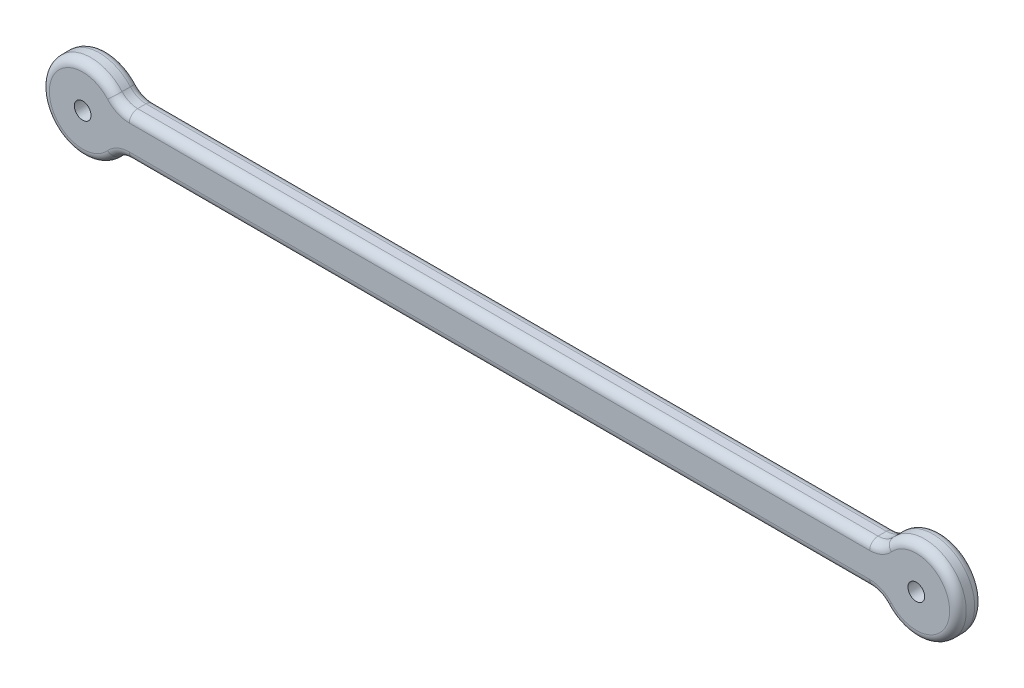
ISO-10303-21;
HEADER;
FILE_DESCRIPTION(('STEP AP214'),'2;1');
FILE_NAME('part.step','',(''),(''),'','','');
FILE_SCHEMA(('AUTOMOTIVE_DESIGN { 1 0 10303 214 1 1 1 1 }'));
ENDSEC;
DATA;
#1=APPLICATION_CONTEXT('core data for automotive mechanical design processes');
#2=APPLICATION_PROTOCOL_DEFINITION('international standard','automotive_design',2000,#1);
#3=PRODUCT_CONTEXT('',#1,'mechanical');
#4=PRODUCT('Part','Part','',(#3));
#5=PRODUCT_RELATED_PRODUCT_CATEGORY('part','',(#4));
#6=PRODUCT_DEFINITION_FORMATION('','',#4);
#7=PRODUCT_DEFINITION_CONTEXT('part definition',#1,'design');
#8=PRODUCT_DEFINITION('design','',#6,#7);
#9=PRODUCT_DEFINITION_SHAPE('','',#8);
#10=(LENGTH_UNIT() NAMED_UNIT(*) SI_UNIT(.MILLI.,.METRE.));
#11=(NAMED_UNIT(*) PLANE_ANGLE_UNIT() SI_UNIT($,.RADIAN.));
#12=(NAMED_UNIT(*) SI_UNIT($,.STERADIAN.) SOLID_ANGLE_UNIT());
#13=UNCERTAINTY_MEASURE_WITH_UNIT(LENGTH_MEASURE(1.E-05),#10,'distance_accuracy_value','');
#14=(GEOMETRIC_REPRESENTATION_CONTEXT(3) GLOBAL_UNCERTAINTY_ASSIGNED_CONTEXT((#13)) GLOBAL_UNIT_ASSIGNED_CONTEXT((#10,
#11,#12)) REPRESENTATION_CONTEXT('',''));
#15=CARTESIAN_POINT('',(0.,0.,0.));
#16=DIRECTION('',(0.,0.,1.));
#17=DIRECTION('',(1.,0.,0.));
#18=AXIS2_PLACEMENT_3D('',#15,#16,#17);
#19=CARTESIAN_POINT('',(88.8196601125,10.,-1.));
#20=DIRECTION('',(0.,0.,1.));
#21=DIRECTION('',(-0.0746580961721727,-0.997209190027823,0.));
#22=AXIS2_PLACEMENT_3D('',#19,#20,#21);
#23=TOROIDAL_SURFACE('',#22,7.,2.);
#24=CARTESIAN_POINT('',(94.0371520600001,5.33333333333287,-1.));
#25=DIRECTION('',(-0.666666666666609,-0.745355992499981,0.));
#26=DIRECTION('',(-0.745355992499982,0.666666666666608,0.));
#27=AXIS2_PLACEMENT_3D('',#24,#25,#26);
#28=CIRCLE('',#27,2.);
#29=CARTESIAN_POINT('',(94.0371520600001,5.3333333333331,-3.));
#30=VERTEX_POINT('',#29);
#31=CARTESIAN_POINT('',(92.5464400750002,6.66666666666667,-1.));
#32=VERTEX_POINT('',#31);
#33=EDGE_CURVE('E133',#30,#32,#28,.F.);
#34=ORIENTED_EDGE('',*,*,#33,.F.);
#35=CARTESIAN_POINT('',(88.8196601125,10.,-3.));
#36=DIRECTION('',(0.,0.,-1.));
#37=DIRECTION('',(0.745355992499995,-0.666666666666594,0.));
#38=AXIS2_PLACEMENT_3D('',#35,#36,#37);
#39=CIRCLE('',#38,7.00000000000029);
#40=CARTESIAN_POINT('',(88.8196601125,2.99999999999993,-3.));
#41=VERTEX_POINT('',#40);
#42=EDGE_CURVE('E127',#30,#41,#39,.T.);
#43=ORIENTED_EDGE('',*,*,#42,.T.);
#44=CARTESIAN_POINT('',(88.8196601125,3.,-1.));
#45=DIRECTION('',(1.,0.,0.));
#46=DIRECTION('',(0.,0.,-1.));
#47=AXIS2_PLACEMENT_3D('',#44,#45,#46);
#48=CIRCLE('',#47,2.);
#49=CARTESIAN_POINT('',(88.8196601125,5.,-1.));
#50=VERTEX_POINT('',#49);
#51=EDGE_CURVE('E131',#50,#41,#48,.F.);
#52=ORIENTED_EDGE('',*,*,#51,.F.);
#53=CARTESIAN_POINT('',(88.8196601125,10.,-1.));
#54=DIRECTION('',(0.,0.,1.));
#55=DIRECTION('',(1.,0.,0.));
#56=AXIS2_PLACEMENT_3D('',#53,#54,#55);
#57=CIRCLE('',#56,5.);
#58=EDGE_CURVE('E249',#50,#32,#57,.T.);
#59=ORIENTED_EDGE('',*,*,#58,.T.);
#60=EDGE_LOOP('',(#34,#43,#52,#59));
#61=FACE_BOUND('',#60,.T.);
#62=ADVANCED_FACE('F15',(#61),#23,.T.);
#63=CARTESIAN_POINT('',(-89.35043386611,3.,-1.));
#64=DIRECTION('',(1.,0.,0.));
#65=DIRECTION('',(0.,0.,-1.));
#66=AXIS2_PLACEMENT_3D('',#63,#64,#65);
#67=CYLINDRICAL_SURFACE('',#66,2.);
#68=ORIENTED_EDGE('',*,*,#51,.T.);
#69=DIRECTION('',(1.,0.,0.));
#70=VECTOR('',#69,1.);
#71=CARTESIAN_POINT('',(0.,3.,-3.));
#72=LINE('',#71,#70);
#73=CARTESIAN_POINT('',(-88.8196601125,3.,-3.));
#74=VERTEX_POINT('',#73);
#75=EDGE_CURVE('E139',#41,#74,#72,.F.);
#76=ORIENTED_EDGE('',*,*,#75,.T.);
#77=CARTESIAN_POINT('',(-88.8196601125,3.,-1.));
#78=DIRECTION('',(1.,0.,0.));
#79=DIRECTION('',(0.,-1.,0.));
#80=AXIS2_PLACEMENT_3D('',#77,#78,#79);
#81=CIRCLE('',#80,2.);
#82=CARTESIAN_POINT('',(-88.8196601125,5.,-1.));
#83=VERTEX_POINT('',#82);
#84=EDGE_CURVE('E149',#83,#74,#81,.F.);
#85=ORIENTED_EDGE('',*,*,#84,.F.);
#86=DIRECTION('',(1.,0.,0.));
#87=VECTOR('',#86,1.);
#88=CARTESIAN_POINT('',(91.33974596216,5.,-1.));
#89=LINE('',#88,#87);
#90=EDGE_CURVE('E147',#50,#83,#89,.F.);
#91=ORIENTED_EDGE('',*,*,#90,.F.);
#92=EDGE_LOOP('',(#68,#76,#85,#91));
#93=FACE_BOUND('',#92,.T.);
#94=ADVANCED_FACE('F144',(#93),#67,.T.);
#95=CARTESIAN_POINT('',(-88.8196601125,10.,-1.));
#96=DIRECTION('',(0.,0.,1.));
#97=DIRECTION('',(-0.793047909677989,-0.609159267314692,0.));
#98=AXIS2_PLACEMENT_3D('',#95,#96,#97);
#99=TOROIDAL_SURFACE('',#98,7.,2.);
#100=ORIENTED_EDGE('',*,*,#84,.T.);
#101=CARTESIAN_POINT('',(-88.8196601125,10.,-3.));
#102=DIRECTION('',(0.,0.,-1.));
#103=DIRECTION('',(0.,-1.,0.));
#104=AXIS2_PLACEMENT_3D('',#101,#102,#103);
#105=CIRCLE('',#104,7.);
#106=CARTESIAN_POINT('',(-94.0371520600001,5.33333333333319,-3.));
#107=VERTEX_POINT('',#106);
#108=EDGE_CURVE('E155',#74,#107,#105,.T.);
#109=ORIENTED_EDGE('',*,*,#108,.T.);
#110=CARTESIAN_POINT('',(-94.0371520600005,5.3333333333332,-1.));
#111=DIRECTION('',(-0.66666666666665,0.745355992499944,0.));
#112=DIRECTION('',(0.745355992499944,0.666666666666651,0.));
#113=AXIS2_PLACEMENT_3D('',#110,#111,#112);
#114=CIRCLE('',#113,2.);
#115=CARTESIAN_POINT('',(-92.5464400750004,6.66666666666664,-1.));
#116=VERTEX_POINT('',#115);
#117=EDGE_CURVE('E332',#116,#107,#114,.T.);
#118=ORIENTED_EDGE('',*,*,#117,.F.);
#119=CARTESIAN_POINT('',(-88.8196601125,10.,-1.));
#120=DIRECTION('',(0.,0.,1.));
#121=DIRECTION('',(1.,0.,0.));
#122=AXIS2_PLACEMENT_3D('',#119,#120,#121);
#123=CIRCLE('',#122,5.);
#124=EDGE_CURVE('E229',#116,#83,#123,.T.);
#125=ORIENTED_EDGE('',*,*,#124,.T.);
#126=EDGE_LOOP('',(#100,#109,#118,#125));
#127=FACE_BOUND('',#126,.T.);
#128=ADVANCED_FACE('F353',(#127),#99,.T.);
#129=CARTESIAN_POINT('',(-100.,0.,-1.));
#130=DIRECTION('',(0.,0.,1.));
#131=DIRECTION('',(0.779674632416826,-0.626184850955121,0.));
#132=AXIS2_PLACEMENT_3D('',#129,#130,#131);
#133=TOROIDAL_SURFACE('',#132,8.,2.);
#134=CARTESIAN_POINT('',(-94.03715206,-5.33333333333384,-1.));
#135=DIRECTION('',(-0.666666666666593,-0.745355992499996,0.));
#136=DIRECTION('',(-0.745355992499995,0.666666666666594,0.));
#137=AXIS2_PLACEMENT_3D('',#134,#135,#136);
#138=CIRCLE('',#137,2.);
#139=CARTESIAN_POINT('',(-92.5464400750001,-6.6666666666669,-1.));
#140=VERTEX_POINT('',#139);
#141=CARTESIAN_POINT('',(-94.0371520600001,-5.33333333333325,-3.));
#142=VERTEX_POINT('',#141);
#143=EDGE_CURVE('E305',#140,#142,#138,.F.);
#144=ORIENTED_EDGE('',*,*,#143,.F.);
#145=CARTESIAN_POINT('',(-100.,0.,-1.));
#146=DIRECTION('',(0.,0.,1.));
#147=DIRECTION('',(1.,0.,0.));
#148=AXIS2_PLACEMENT_3D('',#145,#146,#147);
#149=CIRCLE('',#148,10.);
#150=EDGE_CURVE('E218',#116,#140,#149,.T.);
#151=ORIENTED_EDGE('',*,*,#150,.F.);
#152=ORIENTED_EDGE('',*,*,#117,.T.);
#153=CARTESIAN_POINT('',(-100.,0.,-3.));
#154=DIRECTION('',(0.,0.,1.));
#155=DIRECTION('',(0.745355992499945,0.66666666666665,0.));
#156=AXIS2_PLACEMENT_3D('',#153,#154,#155);
#157=CIRCLE('',#156,8.00000000000009);
#158=EDGE_CURVE('E158',#107,#142,#157,.T.);
#159=ORIENTED_EDGE('',*,*,#158,.T.);
#160=EDGE_LOOP('',(#144,#151,#152,#159));
#161=FACE_BOUND('',#160,.T.);
#162=ADVANCED_FACE('F317',(#161),#133,.T.);
#163=CARTESIAN_POINT('',(-88.8196601125,-10.,-1.));
#164=DIRECTION('',(0.,0.,1.));
#165=DIRECTION('',(0.0746580961721727,0.997209190027823,0.));
#166=AXIS2_PLACEMENT_3D('',#163,#164,#165);
#167=TOROIDAL_SURFACE('',#166,7.,2.);
#168=ORIENTED_EDGE('',*,*,#143,.T.);
#169=CARTESIAN_POINT('',(-88.8196601125,-10.,-3.));
#170=DIRECTION('',(0.,0.,-1.));
#171=DIRECTION('',(-0.745355992499995,0.666666666666594,0.));
#172=AXIS2_PLACEMENT_3D('',#169,#170,#171);
#173=CIRCLE('',#172,7.00000000000029);
#174=CARTESIAN_POINT('',(-88.819660112195,-3.00000000010943,-3.));
#175=VERTEX_POINT('',#174);
#176=EDGE_CURVE('E497',#142,#175,#173,.T.);
#177=ORIENTED_EDGE('',*,*,#176,.T.);
#178=CARTESIAN_POINT('',(-88.81966011182,-3.,-1.));
#179=DIRECTION('',(-1.,0.,0.));
#180=DIRECTION('',(0.,0.,1.));
#181=AXIS2_PLACEMENT_3D('',#178,#179,#180);
#182=CIRCLE('',#181,2.);
#183=CARTESIAN_POINT('',(-88.81966011233,-5.,-1.));
#184=VERTEX_POINT('',#183);
#185=EDGE_CURVE('E300',#184,#175,#182,.F.);
#186=ORIENTED_EDGE('',*,*,#185,.F.);
#187=CARTESIAN_POINT('',(-88.8196601125,-10.,-1.));
#188=DIRECTION('',(0.,0.,1.));
#189=DIRECTION('',(1.,0.,0.));
#190=AXIS2_PLACEMENT_3D('',#187,#188,#189);
#191=CIRCLE('',#190,5.);
#192=EDGE_CURVE('E206',#184,#140,#191,.T.);
#193=ORIENTED_EDGE('',*,*,#192,.T.);
#194=EDGE_LOOP('',(#168,#177,#186,#193));
#195=FACE_BOUND('',#194,.T.);
#196=ADVANCED_FACE('F312',(#195),#167,.T.);
#197=CARTESIAN_POINT('',(89.35043386611,-3.,-1.));
#198=DIRECTION('',(-1.,0.,0.));
#199=DIRECTION('',(0.,0.,1.));
#200=AXIS2_PLACEMENT_3D('',#197,#198,#199);
#201=CYLINDRICAL_SURFACE('',#200,2.);
#202=ORIENTED_EDGE('',*,*,#185,.T.);
#203=DIRECTION('',(1.,0.,0.));
#204=VECTOR('',#203,1.);
#205=CARTESIAN_POINT('',(0.,-3.000000000146,-3.));
#206=LINE('',#205,#204);
#207=CARTESIAN_POINT('',(88.8196601125,-3.,-3.));
#208=VERTEX_POINT('',#207);
#209=EDGE_CURVE('E491',#175,#208,#206,.T.);
#210=ORIENTED_EDGE('',*,*,#209,.T.);
#211=CARTESIAN_POINT('',(88.8196601125,-3.,-1.));
#212=DIRECTION('',(-1.,0.,0.));
#213=DIRECTION('',(0.,1.,0.));
#214=AXIS2_PLACEMENT_3D('',#211,#212,#213);
#215=CIRCLE('',#214,2.);
#216=CARTESIAN_POINT('',(88.8196601125,-5.,-1.));
#217=VERTEX_POINT('',#216);
#218=EDGE_CURVE('E279',#217,#208,#215,.F.);
#219=ORIENTED_EDGE('',*,*,#218,.F.);
#220=DIRECTION('',(1.,0.,0.));
#221=VECTOR('',#220,1.);
#222=CARTESIAN_POINT('',(-91.33974596216,-5.,-1.));
#223=LINE('',#222,#221);
#224=EDGE_CURVE('E195',#184,#217,#223,.T.);
#225=ORIENTED_EDGE('',*,*,#224,.F.);
#226=EDGE_LOOP('',(#202,#210,#219,#225));
#227=FACE_BOUND('',#226,.T.);
#228=ADVANCED_FACE('F316',(#227),#201,.T.);
#229=CARTESIAN_POINT('',(88.8196601125,-10.,-1.));
#230=DIRECTION('',(0.,0.,1.));
#231=DIRECTION('',(0.793047909677989,0.609159267314692,0.));
#232=AXIS2_PLACEMENT_3D('',#229,#230,#231);
#233=TOROIDAL_SURFACE('',#232,7.,2.);
#234=ORIENTED_EDGE('',*,*,#218,.T.);
#235=CARTESIAN_POINT('',(88.8196601125,-10.,-3.));
#236=DIRECTION('',(0.,0.,-1.));
#237=DIRECTION('',(0.,1.,0.));
#238=AXIS2_PLACEMENT_3D('',#235,#236,#237);
#239=CIRCLE('',#238,7.);
#240=CARTESIAN_POINT('',(94.0371520600001,-5.33333333333319,-3.));
#241=VERTEX_POINT('',#240);
#242=EDGE_CURVE('E290',#208,#241,#239,.T.);
#243=ORIENTED_EDGE('',*,*,#242,.T.);
#244=CARTESIAN_POINT('',(94.0371520600005,-5.3333333333332,-1.));
#245=DIRECTION('',(0.66666666666665,-0.745355992499944,0.));
#246=DIRECTION('',(-0.745355992499944,-0.666666666666651,0.));
#247=AXIS2_PLACEMENT_3D('',#244,#245,#246);
#248=CIRCLE('',#247,2.);
#249=CARTESIAN_POINT('',(92.5464400750003,-6.66666666666677,-1.));
#250=VERTEX_POINT('',#249);
#251=EDGE_CURVE('E271',#250,#241,#248,.T.);
#252=ORIENTED_EDGE('',*,*,#251,.F.);
#253=CARTESIAN_POINT('',(88.8196601125,-10.,-1.));
#254=DIRECTION('',(0.,0.,1.));
#255=DIRECTION('',(1.,0.,0.));
#256=AXIS2_PLACEMENT_3D('',#253,#254,#255);
#257=CIRCLE('',#256,5.);
#258=EDGE_CURVE('E184',#250,#217,#257,.T.);
#259=ORIENTED_EDGE('',*,*,#258,.T.);
#260=EDGE_LOOP('',(#234,#243,#252,#259));
#261=FACE_BOUND('',#260,.T.);
#262=ADVANCED_FACE('F262',(#261),#233,.T.);
#263=CARTESIAN_POINT('',(100.,0.,-1.));
#264=DIRECTION('',(0.,0.,1.));
#265=DIRECTION('',(-0.779674632416826,0.626184850955121,0.));
#266=AXIS2_PLACEMENT_3D('',#263,#264,#265);
#267=TOROIDAL_SURFACE('',#266,8.,2.);
#268=ORIENTED_EDGE('',*,*,#33,.T.);
#269=CARTESIAN_POINT('',(100.,0.,-1.));
#270=DIRECTION('',(0.,0.,1.));
#271=DIRECTION('',(1.,0.,0.));
#272=AXIS2_PLACEMENT_3D('',#269,#270,#271);
#273=CIRCLE('',#272,10.);
#274=EDGE_CURVE('E283',#250,#32,#273,.T.);
#275=ORIENTED_EDGE('',*,*,#274,.F.);
#276=ORIENTED_EDGE('',*,*,#251,.T.);
#277=CARTESIAN_POINT('',(100.,0.,-3.));
#278=DIRECTION('',(0.,0.,1.));
#279=DIRECTION('',(-0.745355992499945,-0.66666666666665,0.));
#280=AXIS2_PLACEMENT_3D('',#277,#278,#279);
#281=CIRCLE('',#280,8.00000000000009);
#282=EDGE_CURVE('E169',#241,#30,#281,.T.);
#283=ORIENTED_EDGE('',*,*,#282,.T.);
#284=EDGE_LOOP('',(#268,#275,#276,#283));
#285=FACE_BOUND('',#284,.T.);
#286=ADVANCED_FACE('F256',(#285),#267,.T.);
#287=CARTESIAN_POINT('',(100.,0.,-3.));
#288=DIRECTION('',(0.,0.,1.));
#289=DIRECTION('',(1.,0.,0.));
#290=AXIS2_PLACEMENT_3D('',#287,#288,#289);
#291=CYLINDRICAL_SURFACE('',#290,10.);
#292=DIRECTION('',(0.,0.,1.));
#293=VECTOR('',#292,1.);
#294=CARTESIAN_POINT('',(92.546440075,-6.66666666666703,-10.8216));
#295=LINE('',#294,#293);
#296=CARTESIAN_POINT('',(92.5464400750001,-6.6666666666669,1.));
#297=VERTEX_POINT('',#296);
#298=EDGE_CURVE('E140',#297,#250,#295,.F.);
#299=ORIENTED_EDGE('',*,*,#298,.T.);
#300=ORIENTED_EDGE('',*,*,#274,.T.);
#301=DIRECTION('',(0.,0.,1.));
#302=VECTOR('',#301,1.);
#303=CARTESIAN_POINT('',(92.546440075,6.66666666666703,-10.8216));
#304=LINE('',#303,#302);
#305=CARTESIAN_POINT('',(92.546440075,6.66666666666674,1.));
#306=VERTEX_POINT('',#305);
#307=EDGE_CURVE('E240',#32,#306,#304,.T.);
#308=ORIENTED_EDGE('',*,*,#307,.T.);
#309=CARTESIAN_POINT('',(100.,0.,1.));
#310=DIRECTION('',(0.,0.,1.));
#311=DIRECTION('',(-0.769739187520105,-0.638358506793705,0.));
#312=AXIS2_PLACEMENT_3D('',#309,#310,#311);
#313=CIRCLE('',#312,10.);
#314=EDGE_CURVE('E165',#297,#306,#313,.T.);
#315=ORIENTED_EDGE('',*,*,#314,.F.);
#316=EDGE_LOOP('',(#299,#300,#308,#315));
#317=FACE_BOUND('',#316,.T.);
#318=ADVANCED_FACE('F261',(#317),#291,.T.);
#319=CARTESIAN_POINT('',(88.8196601125,10.,-10.8216));
#320=DIRECTION('',(0.,0.,1.));
#321=DIRECTION('',(1.,0.,0.));
#322=AXIS2_PLACEMENT_3D('',#319,#320,#321);
#323=CYLINDRICAL_SURFACE('',#322,5.);
#324=CARTESIAN_POINT('',(88.8196601125,10.,1.));
#325=DIRECTION('',(0.,0.,1.));
#326=DIRECTION('',(0.811797282516416,-0.583939356525112,0.));
#327=AXIS2_PLACEMENT_3D('',#324,#325,#326);
#328=CIRCLE('',#327,5.);
#329=CARTESIAN_POINT('',(88.8196601125,5.,1.));
#330=VERTEX_POINT('',#329);
#331=EDGE_CURVE('E243',#306,#330,#328,.F.);
#332=ORIENTED_EDGE('',*,*,#331,.F.);
#333=ORIENTED_EDGE('',*,*,#307,.F.);
#334=ORIENTED_EDGE('',*,*,#58,.F.);
#335=DIRECTION('',(0.,0.,1.));
#336=VECTOR('',#335,1.);
#337=CARTESIAN_POINT('',(88.8196601125,5.,-3.));
#338=LINE('',#337,#336);
#339=EDGE_CURVE('E238',#330,#50,#338,.F.);
#340=ORIENTED_EDGE('',*,*,#339,.F.);
#341=EDGE_LOOP('',(#332,#333,#334,#340));
#342=FACE_BOUND('',#341,.T.);
#343=ADVANCED_FACE('F792',(#342),#323,.F.);
#344=CARTESIAN_POINT('',(91.33974596216,5.,-3.));
#345=DIRECTION('',(0.,1.,0.));
#346=DIRECTION('',(0.,0.,1.));
#347=AXIS2_PLACEMENT_3D('',#344,#345,#346);
#348=PLANE('',#347);
#349=ORIENTED_EDGE('',*,*,#339,.T.);
#350=ORIENTED_EDGE('',*,*,#90,.T.);
#351=DIRECTION('',(0.,0.,1.));
#352=VECTOR('',#351,1.);
#353=CARTESIAN_POINT('',(-88.8196601125,5.,-10.8216));
#354=LINE('',#353,#352);
#355=CARTESIAN_POINT('',(-88.8196601126557,5.,1.));
#356=VERTEX_POINT('',#355);
#357=EDGE_CURVE('E219',#83,#356,#354,.T.);
#358=ORIENTED_EDGE('',*,*,#357,.T.);
#359=DIRECTION('',(-1.,0.,0.));
#360=VECTOR('',#359,1.);
#361=CARTESIAN_POINT('',(89.19329824241,5.,1.));
#362=LINE('',#361,#360);
#363=EDGE_CURVE('E232',#330,#356,#362,.T.);
#364=ORIENTED_EDGE('',*,*,#363,.F.);
#365=EDGE_LOOP('',(#349,#350,#358,#364));
#366=FACE_BOUND('',#365,.T.);
#367=ADVANCED_FACE('F377',(#366),#348,.T.);
#368=CARTESIAN_POINT('',(-88.8196601125,10.,-10.8216));
#369=DIRECTION('',(0.,0.,1.));
#370=DIRECTION('',(1.,0.,0.));
#371=AXIS2_PLACEMENT_3D('',#368,#369,#370);
#372=CYLINDRICAL_SURFACE('',#371,5.);
#373=CARTESIAN_POINT('',(-88.8196601125,10.,1.));
#374=DIRECTION('',(0.,0.,1.));
#375=DIRECTION('',(0.105955489701703,-0.994370873568847,0.));
#376=AXIS2_PLACEMENT_3D('',#373,#374,#375);
#377=CIRCLE('',#376,5.);
#378=CARTESIAN_POINT('',(-92.5464400750002,6.66666666666643,1.));
#379=VERTEX_POINT('',#378);
#380=EDGE_CURVE('E222',#356,#379,#377,.F.);
#381=ORIENTED_EDGE('',*,*,#380,.F.);
#382=ORIENTED_EDGE('',*,*,#357,.F.);
#383=ORIENTED_EDGE('',*,*,#124,.F.);
#384=DIRECTION('',(0.,0.,1.));
#385=VECTOR('',#384,1.);
#386=CARTESIAN_POINT('',(-92.5464400750006,6.66666666666651,-3.));
#387=LINE('',#386,#385);
#388=EDGE_CURVE('E215',#379,#116,#387,.F.);
#389=ORIENTED_EDGE('',*,*,#388,.F.);
#390=EDGE_LOOP('',(#381,#382,#383,#389));
#391=FACE_BOUND('',#390,.T.);
#392=ADVANCED_FACE('F381',(#391),#372,.F.);
#393=CARTESIAN_POINT('',(-100.,0.,-3.));
#394=DIRECTION('',(0.,0.,1.));
#395=DIRECTION('',(1.,0.,0.));
#396=AXIS2_PLACEMENT_3D('',#393,#394,#395);
#397=CYLINDRICAL_SURFACE('',#396,10.);
#398=ORIENTED_EDGE('',*,*,#388,.T.);
#399=ORIENTED_EDGE('',*,*,#150,.T.);
#400=DIRECTION('',(0.,0.,1.));
#401=VECTOR('',#400,1.);
#402=CARTESIAN_POINT('',(-92.546440075,-6.66666666666703,-10.8216));
#403=LINE('',#402,#401);
#404=CARTESIAN_POINT('',(-92.546440075,-6.66666666666674,1.));
#405=VERTEX_POINT('',#404);
#406=EDGE_CURVE('E196',#140,#405,#403,.T.);
#407=ORIENTED_EDGE('',*,*,#406,.T.);
#408=CARTESIAN_POINT('',(-100.,0.,1.));
#409=DIRECTION('',(0.,0.,1.));
#410=DIRECTION('',(0.769739187520105,0.638358506793705,0.));
#411=AXIS2_PLACEMENT_3D('',#408,#409,#410);
#412=CIRCLE('',#411,10.);
#413=EDGE_CURVE('E209',#379,#405,#412,.T.);
#414=ORIENTED_EDGE('',*,*,#413,.F.);
#415=EDGE_LOOP('',(#398,#399,#407,#414));
#416=FACE_BOUND('',#415,.T.);
#417=ADVANCED_FACE('F769',(#416),#397,.T.);
#418=CARTESIAN_POINT('',(-88.8196601125,-10.,-10.8216));
#419=DIRECTION('',(0.,0.,1.));
#420=DIRECTION('',(1.,0.,0.));
#421=AXIS2_PLACEMENT_3D('',#418,#419,#420);
#422=CYLINDRICAL_SURFACE('',#421,5.);
#423=CARTESIAN_POINT('',(-88.8196601125,-10.,1.));
#424=DIRECTION('',(0.,0.,1.));
#425=DIRECTION('',(-0.811797282516416,0.583939356525112,0.));
#426=AXIS2_PLACEMENT_3D('',#423,#424,#425);
#427=CIRCLE('',#426,5.);
#428=CARTESIAN_POINT('',(-88.8196601125,-5.,1.));
#429=VERTEX_POINT('',#428);
#430=EDGE_CURVE('E199',#405,#429,#427,.F.);
#431=ORIENTED_EDGE('',*,*,#430,.F.);
#432=ORIENTED_EDGE('',*,*,#406,.F.);
#433=ORIENTED_EDGE('',*,*,#192,.F.);
#434=DIRECTION('',(0.,0.,-1.));
#435=VECTOR('',#434,1.);
#436=CARTESIAN_POINT('',(-88.8196601125,-5.,-3.));
#437=LINE('',#436,#435);
#438=EDGE_CURVE('E192',#429,#184,#437,.T.);
#439=ORIENTED_EDGE('',*,*,#438,.F.);
#440=EDGE_LOOP('',(#431,#432,#433,#439));
#441=FACE_BOUND('',#440,.T.);
#442=ADVANCED_FACE('F514',(#441),#422,.F.);
#443=CARTESIAN_POINT('',(-91.33974596216,-5.,-3.));
#444=DIRECTION('',(0.,-1.,0.));
#445=DIRECTION('',(0.,0.,-1.));
#446=AXIS2_PLACEMENT_3D('',#443,#444,#445);
#447=PLANE('',#446);
#448=ORIENTED_EDGE('',*,*,#438,.T.);
#449=ORIENTED_EDGE('',*,*,#224,.T.);
#450=DIRECTION('',(0.,0.,1.));
#451=VECTOR('',#450,1.);
#452=CARTESIAN_POINT('',(88.8196601125,-5.,-10.8216));
#453=LINE('',#452,#451);
#454=CARTESIAN_POINT('',(88.8196601125,-5.,1.));
#455=VERTEX_POINT('',#454);
#456=EDGE_CURVE('E180',#217,#455,#453,.T.);
#457=ORIENTED_EDGE('',*,*,#456,.T.);
#458=DIRECTION('',(1.,0.,0.));
#459=VECTOR('',#458,1.);
#460=CARTESIAN_POINT('',(-89.19329824241,-5.,1.));
#461=LINE('',#460,#459);
#462=EDGE_CURVE('E187',#429,#455,#461,.T.);
#463=ORIENTED_EDGE('',*,*,#462,.F.);
#464=EDGE_LOOP('',(#448,#449,#457,#463));
#465=FACE_BOUND('',#464,.T.);
#466=ADVANCED_FACE('F510',(#465),#447,.T.);
#467=CARTESIAN_POINT('',(88.8196601125,-10.,-10.8216));
#468=DIRECTION('',(0.,0.,1.));
#469=DIRECTION('',(1.,0.,0.));
#470=AXIS2_PLACEMENT_3D('',#467,#468,#469);
#471=CYLINDRICAL_SURFACE('',#470,5.);
#472=CARTESIAN_POINT('',(88.8196601125,-10.,1.));
#473=DIRECTION('',(0.,0.,1.));
#474=DIRECTION('',(-0.105955489701703,0.994370873568847,0.));
#475=AXIS2_PLACEMENT_3D('',#472,#473,#474);
#476=CIRCLE('',#475,5.);
#477=EDGE_CURVE('E172',#455,#297,#476,.F.);
#478=ORIENTED_EDGE('',*,*,#477,.F.);
#479=ORIENTED_EDGE('',*,*,#456,.F.);
#480=ORIENTED_EDGE('',*,*,#258,.F.);
#481=ORIENTED_EDGE('',*,*,#298,.F.);
#482=EDGE_LOOP('',(#478,#479,#480,#481));
#483=FACE_BOUND('',#482,.T.);
#484=ADVANCED_FACE('F460',(#483),#471,.F.);
#485=CARTESIAN_POINT('',(0.,0.,-3.));
#486=DIRECTION('',(0.,0.,1.));
#487=DIRECTION('',(1.,0.,0.));
#488=AXIS2_PLACEMENT_3D('',#485,#486,#487);
#489=PLANE('',#488);
#490=CARTESIAN_POINT('',(100.,0.,-3.));
#491=DIRECTION('',(0.,0.,1.));
#492=DIRECTION('',(1.,0.,0.));
#493=AXIS2_PLACEMENT_3D('',#490,#491,#492);
#494=CIRCLE('',#493,2.);
#495=CARTESIAN_POINT('',(102.,0.,-3.));
#496=VERTEX_POINT('',#495);
#497=EDGE_CURVE('E662',#496,#496,#494,.T.);
#498=ORIENTED_EDGE('',*,*,#497,.T.);
#499=EDGE_LOOP('',(#498));
#500=FACE_BOUND('',#499,.T.);
#501=CARTESIAN_POINT('',(-100.,0.,-3.));
#502=DIRECTION('',(0.,0.,1.));
#503=DIRECTION('',(1.,0.,0.));
#504=AXIS2_PLACEMENT_3D('',#501,#502,#503);
#505=CIRCLE('',#504,2.);
#506=CARTESIAN_POINT('',(-98.,0.,-3.));
#507=VERTEX_POINT('',#506);
#508=EDGE_CURVE('E20',#507,#507,#505,.T.);
#509=ORIENTED_EDGE('',*,*,#508,.T.);
#510=EDGE_LOOP('',(#509));
#511=FACE_BOUND('',#510,.T.);
#512=ORIENTED_EDGE('',*,*,#242,.F.);
#513=ORIENTED_EDGE('',*,*,#209,.F.);
#514=ORIENTED_EDGE('',*,*,#176,.F.);
#515=ORIENTED_EDGE('',*,*,#158,.F.);
#516=ORIENTED_EDGE('',*,*,#108,.F.);
#517=ORIENTED_EDGE('',*,*,#75,.F.);
#518=ORIENTED_EDGE('',*,*,#42,.F.);
#519=ORIENTED_EDGE('',*,*,#282,.F.);
#520=EDGE_LOOP('',(#512,#513,#514,#515,#516,#517,#518,#519));
#521=FACE_BOUND('',#520,.T.);
#522=ADVANCED_FACE('F153',(#500,#511,#521),#489,.F.);
#523=CARTESIAN_POINT('',(100.,0.,1.));
#524=DIRECTION('',(0.,0.,1.));
#525=DIRECTION('',(-0.769739187520105,-0.638358506793704,0.));
#526=AXIS2_PLACEMENT_3D('',#523,#524,#525);
#527=TOROIDAL_SURFACE('',#526,8.,2.);
#528=CARTESIAN_POINT('',(94.03715206,-5.33333333333384,1.));
#529=DIRECTION('',(-0.666666666666595,0.745355992499994,0.));
#530=DIRECTION('',(0.745355992499992,0.666666666666597,0.));
#531=AXIS2_PLACEMENT_3D('',#528,#529,#530);
#532=CIRCLE('',#531,2.);
#533=CARTESIAN_POINT('',(94.0371520600001,-5.33333333333325,3.));
#534=VERTEX_POINT('',#533);
#535=EDGE_CURVE('E175',#297,#534,#532,.T.);
#536=ORIENTED_EDGE('',*,*,#535,.F.);
#537=ORIENTED_EDGE('',*,*,#314,.T.);
#538=CARTESIAN_POINT('',(94.0371520599996,5.33333333333339,1.));
#539=DIRECTION('',(0.666666666666658,0.745355992499937,0.));
#540=DIRECTION('',(0.745355992499937,-0.666666666666659,0.));
#541=AXIS2_PLACEMENT_3D('',#538,#539,#540);
#542=CIRCLE('',#541,2.);
#543=CARTESIAN_POINT('',(94.0371520599999,5.33333333333321,3.));
#544=VERTEX_POINT('',#543);
#545=EDGE_CURVE('E168',#544,#306,#542,.F.);
#546=ORIENTED_EDGE('',*,*,#545,.F.);
#547=CARTESIAN_POINT('',(100.,0.,3.));
#548=DIRECTION('',(0.,0.,-1.));
#549=DIRECTION('',(-0.745355992499944,0.666666666666651,0.));
#550=AXIS2_PLACEMENT_3D('',#547,#548,#549);
#551=CIRCLE('',#550,8.0000000000001);
#552=EDGE_CURVE('E439',#534,#544,#551,.F.);
#553=ORIENTED_EDGE('',*,*,#552,.F.);
#554=EDGE_LOOP('',(#536,#537,#546,#553));
#555=FACE_BOUND('',#554,.T.);
#556=ADVANCED_FACE('F416',(#555),#527,.T.);
#557=CARTESIAN_POINT('',(88.8196601125,10.,1.));
#558=DIRECTION('',(0.,0.,1.));
#559=DIRECTION('',(0.811797282516416,-0.583939356525112,0.));
#560=AXIS2_PLACEMENT_3D('',#557,#558,#559);
#561=TOROIDAL_SURFACE('',#560,7.,2.);
#562=CARTESIAN_POINT('',(88.8196601125,3.,1.));
#563=DIRECTION('',(-1.,0.,0.));
#564=DIRECTION('',(0.,0.,1.));
#565=AXIS2_PLACEMENT_3D('',#562,#563,#564);
#566=CIRCLE('',#565,2.);
#567=CARTESIAN_POINT('',(88.8196601125,3.,3.));
#568=VERTEX_POINT('',#567);
#569=EDGE_CURVE('E235',#568,#330,#566,.T.);
#570=ORIENTED_EDGE('',*,*,#569,.F.);
#571=CARTESIAN_POINT('',(88.8196601125,10.,3.));
#572=DIRECTION('',(0.,0.,1.));
#573=DIRECTION('',(0.,-1.,0.));
#574=AXIS2_PLACEMENT_3D('',#571,#572,#573);
#575=CIRCLE('',#574,7.);
#576=EDGE_CURVE('E660',#544,#568,#575,.F.);
#577=ORIENTED_EDGE('',*,*,#576,.F.);
#578=ORIENTED_EDGE('',*,*,#545,.T.);
#579=ORIENTED_EDGE('',*,*,#331,.T.);
#580=EDGE_LOOP('',(#570,#577,#578,#579));
#581=FACE_BOUND('',#580,.T.);
#582=ADVANCED_FACE('F410',(#581),#561,.T.);
#583=CARTESIAN_POINT('',(89.19329824241,3.,1.));
#584=DIRECTION('',(-1.,0.,0.));
#585=DIRECTION('',(0.,0.,1.));
#586=AXIS2_PLACEMENT_3D('',#583,#584,#585);
#587=CYLINDRICAL_SURFACE('',#586,2.);
#588=CARTESIAN_POINT('',(-88.8196601126,3.,1.));
#589=DIRECTION('',(1.,-1.4286891114601E-11,0.));
#590=DIRECTION('',(-1.42843098460688E-11,-1.,0.));
#591=AXIS2_PLACEMENT_3D('',#588,#589,#590);
#592=CIRCLE('',#591,2.);
#593=CARTESIAN_POINT('',(-88.8196601126,3.00000000003528,3.));
#594=VERTEX_POINT('',#593);
#595=EDGE_CURVE('E225',#594,#356,#592,.F.);
#596=ORIENTED_EDGE('',*,*,#595,.F.);
#597=DIRECTION('',(1.,0.,0.));
#598=VECTOR('',#597,1.);
#599=CARTESIAN_POINT('',(0.,3.,3.));
#600=LINE('',#599,#598);
#601=EDGE_CURVE('E565',#568,#594,#600,.F.);
#602=ORIENTED_EDGE('',*,*,#601,.F.);
#603=ORIENTED_EDGE('',*,*,#569,.T.);
#604=ORIENTED_EDGE('',*,*,#363,.T.);
#605=EDGE_LOOP('',(#596,#602,#603,#604));
#606=FACE_BOUND('',#605,.T.);
#607=ADVANCED_FACE('F415',(#606),#587,.T.);
#608=CARTESIAN_POINT('',(-88.8196601125,10.,1.));
#609=DIRECTION('',(0.,0.,1.));
#610=DIRECTION('',(0.105955489701705,-0.994370873568847,0.));
#611=AXIS2_PLACEMENT_3D('',#608,#609,#610);
#612=TOROIDAL_SURFACE('',#611,7.,2.);
#613=CARTESIAN_POINT('',(-94.0371520600001,5.33333333333287,1.));
#614=DIRECTION('',(-0.666666666666609,0.745355992499982,0.));
#615=DIRECTION('',(0.74535599249998,0.66666666666661,0.));
#616=AXIS2_PLACEMENT_3D('',#613,#614,#615);
#617=CIRCLE('',#616,2.);
#618=CARTESIAN_POINT('',(-94.0371520600001,5.3333333333331,3.));
#619=VERTEX_POINT('',#618);
#620=EDGE_CURVE('E212',#619,#379,#617,.T.);
#621=ORIENTED_EDGE('',*,*,#620,.F.);
#622=CARTESIAN_POINT('',(-88.8196601125,10.,3.));
#623=DIRECTION('',(0.,0.,1.));
#624=DIRECTION('',(-0.745355992499995,-0.666666666666594,0.));
#625=AXIS2_PLACEMENT_3D('',#622,#623,#624);
#626=CIRCLE('',#625,7.00000000000029);
#627=EDGE_CURVE('E388',#594,#619,#626,.F.);
#628=ORIENTED_EDGE('',*,*,#627,.F.);
#629=ORIENTED_EDGE('',*,*,#595,.T.);
#630=ORIENTED_EDGE('',*,*,#380,.T.);
#631=EDGE_LOOP('',(#621,#628,#629,#630));
#632=FACE_BOUND('',#631,.T.);
#633=ADVANCED_FACE('F386',(#632),#612,.T.);
#634=CARTESIAN_POINT('',(-100.,0.,1.));
#635=DIRECTION('',(0.,0.,1.));
#636=DIRECTION('',(0.769739187520105,0.638358506793704,0.));
#637=AXIS2_PLACEMENT_3D('',#634,#635,#636);
#638=TOROIDAL_SURFACE('',#637,8.,2.);
#639=ORIENTED_EDGE('',*,*,#620,.T.);
#640=ORIENTED_EDGE('',*,*,#413,.T.);
#641=CARTESIAN_POINT('',(-94.0371520599996,-5.33333333333339,1.));
#642=DIRECTION('',(-0.666666666666658,-0.745355992499937,0.));
#643=DIRECTION('',(-0.745355992499937,0.666666666666659,0.));
#644=AXIS2_PLACEMENT_3D('',#641,#642,#643);
#645=CIRCLE('',#644,2.);
#646=CARTESIAN_POINT('',(-94.0371520599999,-5.33333333333321,3.));
#647=VERTEX_POINT('',#646);
#648=EDGE_CURVE('E202',#647,#405,#645,.F.);
#649=ORIENTED_EDGE('',*,*,#648,.F.);
#650=CARTESIAN_POINT('',(-100.,0.,3.));
#651=DIRECTION('',(0.,0.,-1.));
#652=DIRECTION('',(0.745355992499944,-0.666666666666651,0.));
#653=AXIS2_PLACEMENT_3D('',#650,#651,#652);
#654=CIRCLE('',#653,8.0000000000001);
#655=EDGE_CURVE('E558',#619,#647,#654,.F.);
#656=ORIENTED_EDGE('',*,*,#655,.F.);
#657=EDGE_LOOP('',(#639,#640,#649,#656));
#658=FACE_BOUND('',#657,.T.);
#659=ADVANCED_FACE('F538',(#658),#638,.T.);
#660=CARTESIAN_POINT('',(-88.8196601125,-10.,1.));
#661=DIRECTION('',(0.,0.,1.));
#662=DIRECTION('',(-0.811797282516416,0.583939356525112,0.));
#663=AXIS2_PLACEMENT_3D('',#660,#661,#662);
#664=TOROIDAL_SURFACE('',#663,7.,2.);
#665=CARTESIAN_POINT('',(-88.8196601125,-3.,1.));
#666=DIRECTION('',(1.,0.,0.));
#667=DIRECTION('',(0.,0.,-1.));
#668=AXIS2_PLACEMENT_3D('',#665,#666,#667);
#669=CIRCLE('',#668,2.);
#670=CARTESIAN_POINT('',(-88.8196601125,-3.,3.));
#671=VERTEX_POINT('',#670);
#672=EDGE_CURVE('E189',#671,#429,#669,.T.);
#673=ORIENTED_EDGE('',*,*,#672,.F.);
#674=CARTESIAN_POINT('',(-88.8196601125,-10.,3.));
#675=DIRECTION('',(0.,0.,1.));
#676=DIRECTION('',(0.,1.,0.));
#677=AXIS2_PLACEMENT_3D('',#674,#675,#676);
#678=CIRCLE('',#677,7.);
#679=EDGE_CURVE('E521',#647,#671,#678,.F.);
#680=ORIENTED_EDGE('',*,*,#679,.F.);
#681=ORIENTED_EDGE('',*,*,#648,.T.);
#682=ORIENTED_EDGE('',*,*,#430,.T.);
#683=EDGE_LOOP('',(#673,#680,#681,#682));
#684=FACE_BOUND('',#683,.T.);
#685=ADVANCED_FACE('F518',(#684),#664,.T.);
#686=CARTESIAN_POINT('',(-89.19329824241,-3.,1.));
#687=DIRECTION('',(1.,0.,0.));
#688=DIRECTION('',(0.,0.,-1.));
#689=AXIS2_PLACEMENT_3D('',#686,#687,#688);
#690=CYLINDRICAL_SURFACE('',#689,2.);
#691=CARTESIAN_POINT('',(88.8196601125,-3.,1.));
#692=DIRECTION('',(-1.,0.,0.));
#693=DIRECTION('',(0.,1.,0.));
#694=AXIS2_PLACEMENT_3D('',#691,#692,#693);
#695=CIRCLE('',#694,2.);
#696=CARTESIAN_POINT('',(88.8196601125,-2.99999999999985,3.));
#697=VERTEX_POINT('',#696);
#698=EDGE_CURVE('E35',#697,#455,#695,.F.);
#699=ORIENTED_EDGE('',*,*,#698,.F.);
#700=DIRECTION('',(1.,0.,0.));
#701=VECTOR('',#700,1.);
#702=CARTESIAN_POINT('',(0.,-3.,3.));
#703=LINE('',#702,#701);
#704=EDGE_CURVE('E613',#671,#697,#703,.T.);
#705=ORIENTED_EDGE('',*,*,#704,.F.);
#706=ORIENTED_EDGE('',*,*,#672,.T.);
#707=ORIENTED_EDGE('',*,*,#462,.T.);
#708=EDGE_LOOP('',(#699,#705,#706,#707));
#709=FACE_BOUND('',#708,.T.);
#710=ADVANCED_FACE('F630',(#709),#690,.T.);
#711=CARTESIAN_POINT('',(88.8196601125,-10.,1.));
#712=DIRECTION('',(0.,0.,1.));
#713=DIRECTION('',(-0.105955489701705,0.994370873568847,0.));
#714=AXIS2_PLACEMENT_3D('',#711,#712,#713);
#715=TOROIDAL_SURFACE('',#714,7.,2.);
#716=ORIENTED_EDGE('',*,*,#535,.T.);
#717=CARTESIAN_POINT('',(88.8196601125,-10.,3.));
#718=DIRECTION('',(0.,0.,1.));
#719=DIRECTION('',(0.745355992499995,0.666666666666594,0.));
#720=AXIS2_PLACEMENT_3D('',#717,#718,#719);
#721=CIRCLE('',#720,7.00000000000029);
#722=EDGE_CURVE('E609',#697,#534,#721,.F.);
#723=ORIENTED_EDGE('',*,*,#722,.F.);
#724=ORIENTED_EDGE('',*,*,#698,.T.);
#725=ORIENTED_EDGE('',*,*,#477,.T.);
#726=EDGE_LOOP('',(#716,#723,#724,#725));
#727=FACE_BOUND('',#726,.T.);
#728=ADVANCED_FACE('F626',(#727),#715,.T.);
#729=CARTESIAN_POINT('',(-100.,0.,-3.));
#730=DIRECTION('',(0.,0.,1.));
#731=DIRECTION('',(1.,0.,0.));
#732=AXIS2_PLACEMENT_3D('',#729,#730,#731);
#733=CYLINDRICAL_SURFACE('',#732,2.);
#734=CARTESIAN_POINT('',(-100.,0.,3.));
#735=DIRECTION('',(0.,0.,1.));
#736=DIRECTION('',(1.,0.,0.));
#737=AXIS2_PLACEMENT_3D('',#734,#735,#736);
#738=CIRCLE('',#737,2.);
#739=CARTESIAN_POINT('',(-98.,0.,3.));
#740=VERTEX_POINT('',#739);
#741=EDGE_CURVE('E26',#740,#740,#738,.F.);
#742=ORIENTED_EDGE('',*,*,#741,.F.);
#743=EDGE_LOOP('',(#742));
#744=FACE_BOUND('',#743,.T.);
#745=ORIENTED_EDGE('',*,*,#508,.F.);
#746=EDGE_LOOP('',(#745));
#747=FACE_BOUND('',#746,.T.);
#748=ADVANCED_FACE('F629',(#744,#747),#733,.F.);
#749=CARTESIAN_POINT('',(100.,0.,-3.));
#750=DIRECTION('',(0.,0.,1.));
#751=DIRECTION('',(1.,0.,0.));
#752=AXIS2_PLACEMENT_3D('',#749,#750,#751);
#753=CYLINDRICAL_SURFACE('',#752,2.);
#754=CARTESIAN_POINT('',(100.,0.,3.));
#755=DIRECTION('',(0.,0.,1.));
#756=DIRECTION('',(1.,0.,0.));
#757=AXIS2_PLACEMENT_3D('',#754,#755,#756);
#758=CIRCLE('',#757,2.);
#759=CARTESIAN_POINT('',(102.,0.,3.));
#760=VERTEX_POINT('',#759);
#761=EDGE_CURVE('E9',#760,#760,#758,.F.);
#762=ORIENTED_EDGE('',*,*,#761,.F.);
#763=EDGE_LOOP('',(#762));
#764=FACE_BOUND('',#763,.T.);
#765=ORIENTED_EDGE('',*,*,#497,.F.);
#766=EDGE_LOOP('',(#765));
#767=FACE_BOUND('',#766,.T.);
#768=ADVANCED_FACE('F583',(#764,#767),#753,.F.);
#769=CARTESIAN_POINT('',(0.,0.,3.));
#770=DIRECTION('',(0.,0.,1.));
#771=DIRECTION('',(1.,0.,0.));
#772=AXIS2_PLACEMENT_3D('',#769,#770,#771);
#773=PLANE('',#772);
#774=ORIENTED_EDGE('',*,*,#761,.T.);
#775=EDGE_LOOP('',(#774));
#776=FACE_BOUND('',#775,.T.);
#777=ORIENTED_EDGE('',*,*,#741,.T.);
#778=EDGE_LOOP('',(#777));
#779=FACE_BOUND('',#778,.T.);
#780=ORIENTED_EDGE('',*,*,#704,.T.);
#781=ORIENTED_EDGE('',*,*,#722,.T.);
#782=ORIENTED_EDGE('',*,*,#552,.T.);
#783=ORIENTED_EDGE('',*,*,#576,.T.);
#784=ORIENTED_EDGE('',*,*,#601,.T.);
#785=ORIENTED_EDGE('',*,*,#627,.T.);
#786=ORIENTED_EDGE('',*,*,#655,.T.);
#787=ORIENTED_EDGE('',*,*,#679,.T.);
#788=EDGE_LOOP('',(#780,#781,#782,#783,#784,#785,#786,#787));
#789=FACE_BOUND('',#788,.T.);
#790=ADVANCED_FACE('F563',(#776,#779,#789),#773,.T.);
#791=CLOSED_SHELL('',(#62,#94,#128,#162,#196,#228,#262,#286,#318,#343,#367,#392,#417,#442,#466,
#484,#522,#556,#582,#607,#633,#659,#685,#710,#728,#748,#768,#790));
#792=MANIFOLD_SOLID_BREP('B1',#791);
#793=ADVANCED_BREP_SHAPE_REPRESENTATION('',(#18,#792),#14);
#794=SHAPE_DEFINITION_REPRESENTATION(#9,#793);
ENDSEC;
END-ISO-10303-21;
